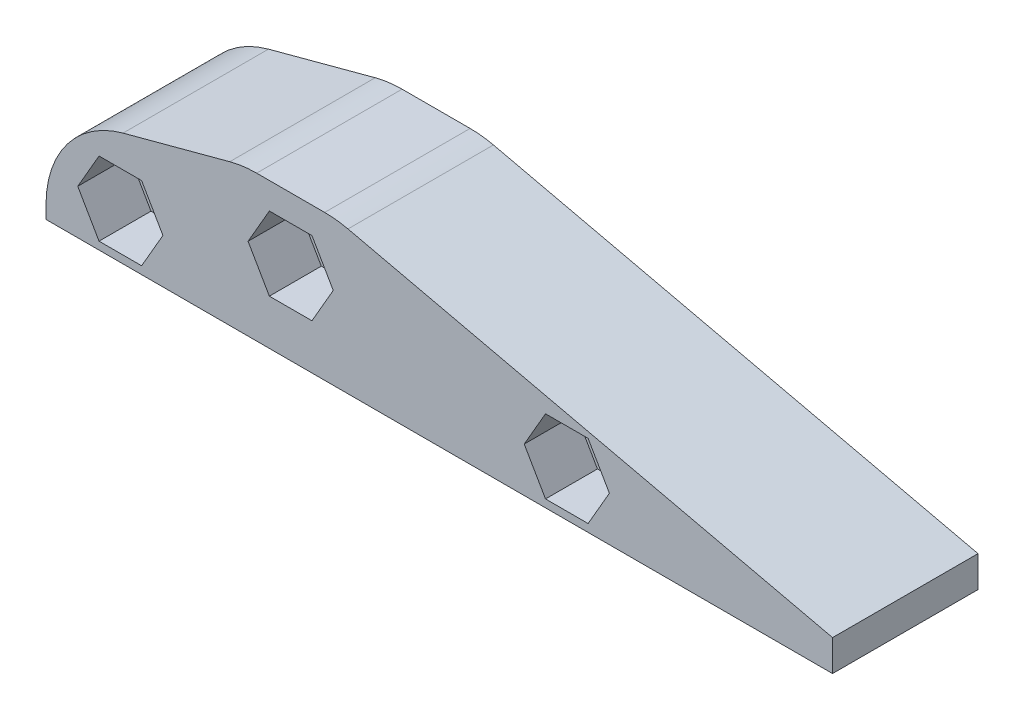
ISO-10303-21;
HEADER;
FILE_DESCRIPTION(('STEP AP214'),'2;1');
FILE_NAME('part.step','',(''),(''),'','','');
FILE_SCHEMA(('AUTOMOTIVE_DESIGN { 1 0 10303 214 1 1 1 1 }'));
ENDSEC;
DATA;
#1=APPLICATION_CONTEXT('core data for automotive mechanical design processes');
#2=APPLICATION_PROTOCOL_DEFINITION('international standard','automotive_design',2000,#1);
#3=PRODUCT_CONTEXT('',#1,'mechanical');
#4=PRODUCT('Part','Part','',(#3));
#5=PRODUCT_RELATED_PRODUCT_CATEGORY('part','',(#4));
#6=PRODUCT_DEFINITION_FORMATION('','',#4);
#7=PRODUCT_DEFINITION_CONTEXT('part definition',#1,'design');
#8=PRODUCT_DEFINITION('design','',#6,#7);
#9=PRODUCT_DEFINITION_SHAPE('','',#8);
#10=(LENGTH_UNIT() NAMED_UNIT(*) SI_UNIT(.MILLI.,.METRE.));
#11=(NAMED_UNIT(*) PLANE_ANGLE_UNIT() SI_UNIT($,.RADIAN.));
#12=(NAMED_UNIT(*) SI_UNIT($,.STERADIAN.) SOLID_ANGLE_UNIT());
#13=UNCERTAINTY_MEASURE_WITH_UNIT(LENGTH_MEASURE(1.E-05),#10,'distance_accuracy_value','');
#14=(GEOMETRIC_REPRESENTATION_CONTEXT(3) GLOBAL_UNCERTAINTY_ASSIGNED_CONTEXT((#13)) GLOBAL_UNIT_ASSIGNED_CONTEXT((#10,
#11,#12)) REPRESENTATION_CONTEXT('',''));
#15=CARTESIAN_POINT('',(0.,0.,0.));
#16=DIRECTION('',(0.,0.,1.));
#17=DIRECTION('',(1.,0.,0.));
#18=AXIS2_PLACEMENT_3D('',#15,#16,#17);
#19=CARTESIAN_POINT('',(75.7081636477034,0.,14.));
#20=DIRECTION('',(0.,1.,0.));
#21=DIRECTION('',(-1.,0.,0.));
#22=AXIS2_PLACEMENT_3D('',#19,#20,#21);
#23=PLANE('',#22);
#24=DIRECTION('',(1.,0.,0.));
#25=VECTOR('',#24,1.);
#26=CARTESIAN_POINT('',(75.7081636477034,0.,0.));
#27=LINE('',#26,#25);
#28=CARTESIAN_POINT('',(0.,0.,0.));
#29=VERTEX_POINT('',#28);
#30=CARTESIAN_POINT('',(75.7081636477034,0.,0.));
#31=VERTEX_POINT('',#30);
#32=EDGE_CURVE('E355',#29,#31,#27,.T.);
#33=ORIENTED_EDGE('',*,*,#32,.T.);
#34=DIRECTION('',(0.,0.,-1.));
#35=VECTOR('',#34,1.);
#36=CARTESIAN_POINT('',(75.7081636477034,0.,14.));
#37=LINE('',#36,#35);
#38=CARTESIAN_POINT('',(75.7081636477034,0.,14.));
#39=VERTEX_POINT('',#38);
#40=EDGE_CURVE('E401',#39,#31,#37,.T.);
#41=ORIENTED_EDGE('',*,*,#40,.F.);
#42=DIRECTION('',(1.,0.,0.));
#43=VECTOR('',#42,1.);
#44=CARTESIAN_POINT('',(75.7081636477034,0.,14.));
#45=LINE('',#44,#43);
#46=CARTESIAN_POINT('',(0.,0.,14.));
#47=VERTEX_POINT('',#46);
#48=EDGE_CURVE('E366',#47,#39,#45,.T.);
#49=ORIENTED_EDGE('',*,*,#48,.F.);
#50=DIRECTION('',(0.,0.,-1.));
#51=VECTOR('',#50,1.);
#52=CARTESIAN_POINT('',(0.,0.,14.));
#53=LINE('',#52,#51);
#54=EDGE_CURVE('E382',#47,#29,#53,.T.);
#55=ORIENTED_EDGE('',*,*,#54,.T.);
#56=EDGE_LOOP('',(#33,#41,#49,#55));
#57=FACE_BOUND('',#56,.T.);
#58=ADVANCED_FACE('F34',(#57),#23,.F.);
#59=CARTESIAN_POINT('',(75.7081636477034,3.,14.));
#60=DIRECTION('',(-1.,0.,0.));
#61=DIRECTION('',(0.,0.,1.));
#62=AXIS2_PLACEMENT_3D('',#59,#60,#61);
#63=PLANE('',#62);
#64=DIRECTION('',(0.,1.,0.));
#65=VECTOR('',#64,1.);
#66=CARTESIAN_POINT('',(75.7081636477034,3.,0.));
#67=LINE('',#66,#65);
#68=CARTESIAN_POINT('',(75.7081636477034,3.,0.));
#69=VERTEX_POINT('',#68);
#70=EDGE_CURVE('E385',#31,#69,#67,.T.);
#71=ORIENTED_EDGE('',*,*,#70,.T.);
#72=DIRECTION('',(0.,0.,-1.));
#73=VECTOR('',#72,1.);
#74=CARTESIAN_POINT('',(75.7081636477034,3.,14.));
#75=LINE('',#74,#73);
#76=CARTESIAN_POINT('',(75.7081636477034,3.,14.));
#77=VERTEX_POINT('',#76);
#78=EDGE_CURVE('E398',#77,#69,#75,.T.);
#79=ORIENTED_EDGE('',*,*,#78,.F.);
#80=DIRECTION('',(0.,1.,0.));
#81=VECTOR('',#80,1.);
#82=CARTESIAN_POINT('',(75.7081636477034,3.,14.));
#83=LINE('',#82,#81);
#84=EDGE_CURVE('E369',#39,#77,#83,.T.);
#85=ORIENTED_EDGE('',*,*,#84,.F.);
#86=ORIENTED_EDGE('',*,*,#40,.T.);
#87=EDGE_LOOP('',(#71,#79,#85,#86));
#88=FACE_BOUND('',#87,.T.);
#89=ADVANCED_FACE('F448',(#88),#63,.F.);
#90=CARTESIAN_POINT('',(27.9588181024501,14.,14.));
#91=DIRECTION('',(-0.224489795918367,-0.974476439699047,0.));
#92=DIRECTION('',(0.974476439699047,-0.224489795918367,0.));
#93=AXIS2_PLACEMENT_3D('',#90,#91,#92);
#94=PLANE('',#93);
#95=DIRECTION('',(-0.974476439699047,0.224489795918367,0.));
#96=VECTOR('',#95,1.);
#97=CARTESIAN_POINT('',(27.9588181024501,14.,0.));
#98=LINE('',#97,#96);
#99=CARTESIAN_POINT('',(29.0667574664095,13.7447643969905,0.));
#100=VERTEX_POINT('',#99);
#101=EDGE_CURVE('E387',#69,#100,#98,.T.);
#102=ORIENTED_EDGE('',*,*,#101,.T.);
#103=DIRECTION('',(0.,0.,-1.));
#104=VECTOR('',#103,1.);
#105=CARTESIAN_POINT('',(29.0667574664095,13.7447643969905,14.));
#106=LINE('',#105,#104);
#107=CARTESIAN_POINT('',(29.0667574664095,13.7447643969905,14.));
#108=VERTEX_POINT('',#107);
#109=EDGE_CURVE('E424',#100,#108,#106,.F.);
#110=ORIENTED_EDGE('',*,*,#109,.T.);
#111=DIRECTION('',(-0.974476439699047,0.224489795918367,0.));
#112=VECTOR('',#111,1.);
#113=CARTESIAN_POINT('',(27.9588181024501,14.,14.));
#114=LINE('',#113,#112);
#115=EDGE_CURVE('E372',#77,#108,#114,.T.);
#116=ORIENTED_EDGE('',*,*,#115,.F.);
#117=ORIENTED_EDGE('',*,*,#78,.T.);
#118=EDGE_LOOP('',(#102,#110,#116,#117));
#119=FACE_BOUND('',#118,.T.);
#120=ADVANCED_FACE('F445',(#119),#94,.F.);
#121=CARTESIAN_POINT('',(18.9588181024501,14.,14.));
#122=DIRECTION('',(0.,-1.,0.));
#123=DIRECTION('',(0.,0.,-1.));
#124=AXIS2_PLACEMENT_3D('',#121,#122,#123);
#125=PLANE('',#124);
#126=DIRECTION('',(-1.,0.,0.));
#127=VECTOR('',#126,1.);
#128=CARTESIAN_POINT('',(18.9588181024501,14.,14.));
#129=LINE('',#128,#127);
#130=CARTESIAN_POINT('',(26.8218595072258,14.,14.));
#131=VERTEX_POINT('',#130);
#132=CARTESIAN_POINT('',(20.275343078324,14.,14.));
#133=VERTEX_POINT('',#132);
#134=EDGE_CURVE('E375',#131,#133,#129,.T.);
#135=ORIENTED_EDGE('',*,*,#134,.F.);
#136=DIRECTION('',(0.,0.,-1.));
#137=VECTOR('',#136,1.);
#138=CARTESIAN_POINT('',(26.8218595072258,14.,14.));
#139=LINE('',#138,#137);
#140=CARTESIAN_POINT('',(26.8218595072258,14.,0.));
#141=VERTEX_POINT('',#140);
#142=EDGE_CURVE('E417',#131,#141,#139,.T.);
#143=ORIENTED_EDGE('',*,*,#142,.T.);
#144=DIRECTION('',(-1.,0.,0.));
#145=VECTOR('',#144,1.);
#146=CARTESIAN_POINT('',(18.9588181024501,14.,0.));
#147=LINE('',#146,#145);
#148=CARTESIAN_POINT('',(20.275343078324,14.,0.));
#149=VERTEX_POINT('',#148);
#150=EDGE_CURVE('E390',#141,#149,#147,.T.);
#151=ORIENTED_EDGE('',*,*,#150,.T.);
#152=DIRECTION('',(0.,0.,-1.));
#153=VECTOR('',#152,1.);
#154=CARTESIAN_POINT('',(20.275343078324,14.,14.));
#155=LINE('',#154,#153);
#156=EDGE_CURVE('E415',#149,#133,#155,.F.);
#157=ORIENTED_EDGE('',*,*,#156,.T.);
#158=EDGE_LOOP('',(#135,#143,#151,#157));
#159=FACE_BOUND('',#158,.T.);
#160=ADVANCED_FACE('F437',(#159),#125,.F.);
#161=CARTESIAN_POINT('',(0.,8.92,14.));
#162=DIRECTION('',(0.258819045102518,-0.965925826289069,0.));
#163=DIRECTION('',(0.965925826289069,0.258819045102518,0.));
#164=AXIS2_PLACEMENT_3D('',#161,#162,#163);
#165=PLANE('',#164);
#166=DIRECTION('',(-0.965925826289069,-0.258819045102518,0.));
#167=VECTOR('',#166,1.);
#168=CARTESIAN_POINT('',(0.,8.92,14.));
#169=LINE('',#168,#167);
#170=CARTESIAN_POINT('',(17.6871526272989,13.6592582628907,14.));
#171=VERTEX_POINT('',#170);
#172=CARTESIAN_POINT('',(7.41180954897482,10.9059883831011,14.));
#173=VERTEX_POINT('',#172);
#174=EDGE_CURVE('E378',#171,#173,#169,.T.);
#175=ORIENTED_EDGE('',*,*,#174,.F.);
#176=DIRECTION('',(0.,0.,-1.));
#177=VECTOR('',#176,1.);
#178=CARTESIAN_POINT('',(17.6871526272989,13.6592582628907,14.));
#179=LINE('',#178,#177);
#180=CARTESIAN_POINT('',(17.6871526272989,13.6592582628907,0.));
#181=VERTEX_POINT('',#180);
#182=EDGE_CURVE('E11',#171,#181,#179,.T.);
#183=ORIENTED_EDGE('',*,*,#182,.T.);
#184=DIRECTION('',(-0.965925826289069,-0.258819045102518,0.));
#185=VECTOR('',#184,1.);
#186=CARTESIAN_POINT('',(0.,8.92,0.));
#187=LINE('',#186,#185);
#188=CARTESIAN_POINT('',(7.41180954897482,10.9059883831011,0.));
#189=VERTEX_POINT('',#188);
#190=EDGE_CURVE('E393',#181,#189,#187,.T.);
#191=ORIENTED_EDGE('',*,*,#190,.T.);
#192=DIRECTION('',(0.,0.,-1.));
#193=VECTOR('',#192,1.);
#194=CARTESIAN_POINT('',(7.41180954897482,10.9059883831011,14.));
#195=LINE('',#194,#193);
#196=EDGE_CURVE('E410',#189,#173,#195,.F.);
#197=ORIENTED_EDGE('',*,*,#196,.T.);
#198=EDGE_LOOP('',(#175,#183,#191,#197));
#199=FACE_BOUND('',#198,.T.);
#200=ADVANCED_FACE('F466',(#199),#165,.F.);
#201=CARTESIAN_POINT('',(0.,0.,14.));
#202=DIRECTION('',(1.,0.,0.));
#203=DIRECTION('',(0.,0.,-1.));
#204=AXIS2_PLACEMENT_3D('',#201,#202,#203);
#205=PLANE('',#204);
#206=DIRECTION('',(0.,-1.,0.));
#207=VECTOR('',#206,1.);
#208=CARTESIAN_POINT('',(0.,0.,14.));
#209=LINE('',#208,#207);
#210=CARTESIAN_POINT('',(0.,1.24673012021037,14.));
#211=VERTEX_POINT('',#210);
#212=EDGE_CURVE('E380',#211,#47,#209,.T.);
#213=ORIENTED_EDGE('',*,*,#212,.F.);
#214=DIRECTION('',(0.,0.,-1.));
#215=VECTOR('',#214,1.);
#216=CARTESIAN_POINT('',(0.,1.24673012021037,14.));
#217=LINE('',#216,#215);
#218=CARTESIAN_POINT('',(0.,1.24673012021037,0.));
#219=VERTEX_POINT('',#218);
#220=EDGE_CURVE('E404',#211,#219,#217,.T.);
#221=ORIENTED_EDGE('',*,*,#220,.T.);
#222=DIRECTION('',(0.,-1.,0.));
#223=VECTOR('',#222,1.);
#224=CARTESIAN_POINT('',(0.,0.,0.));
#225=LINE('',#224,#223);
#226=EDGE_CURVE('E370',#219,#29,#225,.T.);
#227=ORIENTED_EDGE('',*,*,#226,.T.);
#228=ORIENTED_EDGE('',*,*,#54,.F.);
#229=EDGE_LOOP('',(#213,#221,#227,#228));
#230=FACE_BOUND('',#229,.T.);
#231=ADVANCED_FACE('F457',(#230),#205,.F.);
#232=CARTESIAN_POINT('',(0.,0.,14.));
#233=DIRECTION('',(0.,0.,-1.));
#234=DIRECTION('',(-1.,0.,0.));
#235=AXIS2_PLACEMENT_3D('',#232,#233,#234);
#236=PLANE('',#235);
#237=DIRECTION('',(0.5,0.866025403784438,0.));
#238=VECTOR('',#237,1.);
#239=CARTESIAN_POINT('',(25.5981947483981,4.35688835550412,14.));
#240=LINE('',#239,#238);
#241=CARTESIAN_POINT('',(25.5981947483981,4.35688835550412,14.));
#242=VERTEX_POINT('',#241);
#243=CARTESIAN_POINT('',(27.6477882040213,7.90688835550412,14.));
#244=VERTEX_POINT('',#243);
#245=EDGE_CURVE('E251',#242,#244,#240,.T.);
#246=ORIENTED_EDGE('',*,*,#245,.F.);
#247=DIRECTION('',(1.,0.,0.));
#248=VECTOR('',#247,1.);
#249=CARTESIAN_POINT('',(21.4990078371518,4.35688835550412,14.));
#250=LINE('',#249,#248);
#251=CARTESIAN_POINT('',(21.4990078371518,4.35688835550412,14.));
#252=VERTEX_POINT('',#251);
#253=EDGE_CURVE('E49',#252,#242,#250,.T.);
#254=ORIENTED_EDGE('',*,*,#253,.F.);
#255=DIRECTION('',(0.499999999999999,-0.866025403784439,0.));
#256=VECTOR('',#255,1.);
#257=CARTESIAN_POINT('',(19.4494143815286,7.90688835550412,14.));
#258=LINE('',#257,#256);
#259=CARTESIAN_POINT('',(19.4494143815286,7.90688835550412,14.));
#260=VERTEX_POINT('',#259);
#261=EDGE_CURVE('E234',#260,#252,#258,.T.);
#262=ORIENTED_EDGE('',*,*,#261,.F.);
#263=DIRECTION('',(-0.5,-0.866025403784439,0.));
#264=VECTOR('',#263,1.);
#265=CARTESIAN_POINT('',(21.4990078371518,11.4568883555041,14.));
#266=LINE('',#265,#264);
#267=CARTESIAN_POINT('',(21.4990078371518,11.4568883555041,14.));
#268=VERTEX_POINT('',#267);
#269=EDGE_CURVE('E237',#268,#260,#266,.T.);
#270=ORIENTED_EDGE('',*,*,#269,.F.);
#271=DIRECTION('',(-1.,0.,0.));
#272=VECTOR('',#271,1.);
#273=CARTESIAN_POINT('',(25.5981947483981,11.4568883555041,14.));
#274=LINE('',#273,#272);
#275=CARTESIAN_POINT('',(25.5981947483981,11.4568883555041,14.));
#276=VERTEX_POINT('',#275);
#277=EDGE_CURVE('E257',#276,#268,#274,.T.);
#278=ORIENTED_EDGE('',*,*,#277,.F.);
#279=DIRECTION('',(-0.5,0.866025403784438,0.));
#280=VECTOR('',#279,1.);
#281=CARTESIAN_POINT('',(27.6477882040213,7.90688835550412,14.));
#282=LINE('',#281,#280);
#283=EDGE_CURVE('E254',#244,#276,#282,.T.);
#284=ORIENTED_EDGE('',*,*,#283,.F.);
#285=EDGE_LOOP('',(#246,#254,#262,#270,#278,#284));
#286=FACE_BOUND('',#285,.T.);
#287=DIRECTION('',(0.5,0.866025403784438,0.));
#288=VECTOR('',#287,1.);
#289=CARTESIAN_POINT('',(52.1792396702856,0.743591352414853,14.));
#290=LINE('',#289,#288);
#291=CARTESIAN_POINT('',(52.1792396702856,0.743591352414853,14.));
#292=VERTEX_POINT('',#291);
#293=CARTESIAN_POINT('',(54.2288331259088,4.29359135241486,14.));
#294=VERTEX_POINT('',#293);
#295=EDGE_CURVE('E293',#292,#294,#290,.T.);
#296=ORIENTED_EDGE('',*,*,#295,.F.);
#297=DIRECTION('',(1.,0.,0.));
#298=VECTOR('',#297,1.);
#299=CARTESIAN_POINT('',(48.0800527590393,0.743591352414853,14.));
#300=LINE('',#299,#298);
#301=CARTESIAN_POINT('',(48.0800527590393,0.743591352414853,14.));
#302=VERTEX_POINT('',#301);
#303=EDGE_CURVE('E57',#302,#292,#300,.T.);
#304=ORIENTED_EDGE('',*,*,#303,.F.);
#305=DIRECTION('',(0.5,-0.866025403784438,0.));
#306=VECTOR('',#305,1.);
#307=CARTESIAN_POINT('',(46.0304593034161,4.29359135241486,14.));
#308=LINE('',#307,#306);
#309=CARTESIAN_POINT('',(46.0304593034161,4.29359135241486,14.));
#310=VERTEX_POINT('',#309);
#311=EDGE_CURVE('E276',#310,#302,#308,.T.);
#312=ORIENTED_EDGE('',*,*,#311,.F.);
#313=DIRECTION('',(-0.5,-0.866025403784438,0.));
#314=VECTOR('',#313,1.);
#315=CARTESIAN_POINT('',(48.0800527590392,7.84359135241487,14.));
#316=LINE('',#315,#314);
#317=CARTESIAN_POINT('',(48.0800527590392,7.84359135241487,14.));
#318=VERTEX_POINT('',#317);
#319=EDGE_CURVE('E303',#318,#310,#316,.T.);
#320=ORIENTED_EDGE('',*,*,#319,.F.);
#321=DIRECTION('',(-1.,0.,0.));
#322=VECTOR('',#321,1.);
#323=CARTESIAN_POINT('',(52.1792396702856,7.84359135241487,14.));
#324=LINE('',#323,#322);
#325=CARTESIAN_POINT('',(52.1792396702856,7.84359135241487,14.));
#326=VERTEX_POINT('',#325);
#327=EDGE_CURVE('E300',#326,#318,#324,.T.);
#328=ORIENTED_EDGE('',*,*,#327,.F.);
#329=DIRECTION('',(-0.499999999999999,0.866025403784439,0.));
#330=VECTOR('',#329,1.);
#331=CARTESIAN_POINT('',(54.2288331259088,4.29359135241486,14.));
#332=LINE('',#331,#330);
#333=EDGE_CURVE('E297',#294,#326,#332,.T.);
#334=ORIENTED_EDGE('',*,*,#333,.F.);
#335=EDGE_LOOP('',(#296,#304,#312,#320,#328,#334));
#336=FACE_BOUND('',#335,.T.);
#337=DIRECTION('',(0.5,0.866025403784439,0.));
#338=VECTOR('',#337,1.);
#339=CARTESIAN_POINT('',(9.2045979231864,0.743591352414859,14.));
#340=LINE('',#339,#338);
#341=CARTESIAN_POINT('',(9.2045979231864,0.743591352414859,14.));
#342=VERTEX_POINT('',#341);
#343=CARTESIAN_POINT('',(11.2541913788096,4.29359135241486,14.));
#344=VERTEX_POINT('',#343);
#345=EDGE_CURVE('E339',#342,#344,#340,.T.);
#346=ORIENTED_EDGE('',*,*,#345,.F.);
#347=DIRECTION('',(1.,0.,0.));
#348=VECTOR('',#347,1.);
#349=CARTESIAN_POINT('',(5.10541101194006,0.743591352414859,14.));
#350=LINE('',#349,#348);
#351=CARTESIAN_POINT('',(5.10541101194006,0.743591352414859,14.));
#352=VERTEX_POINT('',#351);
#353=EDGE_CURVE('E264',#352,#342,#350,.T.);
#354=ORIENTED_EDGE('',*,*,#353,.F.);
#355=DIRECTION('',(0.5,-0.866025403784439,0.));
#356=VECTOR('',#355,1.);
#357=CARTESIAN_POINT('',(3.05581755631689,4.29359135241486,14.));
#358=LINE('',#357,#356);
#359=CARTESIAN_POINT('',(3.05581755631689,4.29359135241486,14.));
#360=VERTEX_POINT('',#359);
#361=EDGE_CURVE('E322',#360,#352,#358,.T.);
#362=ORIENTED_EDGE('',*,*,#361,.F.);
#363=DIRECTION('',(-0.5,-0.866025403784439,0.));
#364=VECTOR('',#363,1.);
#365=CARTESIAN_POINT('',(5.10541101194006,7.84359135241486,14.));
#366=LINE('',#365,#364);
#367=CARTESIAN_POINT('',(5.10541101194006,7.84359135241486,14.));
#368=VERTEX_POINT('',#367);
#369=EDGE_CURVE('E348',#368,#360,#366,.T.);
#370=ORIENTED_EDGE('',*,*,#369,.F.);
#371=DIRECTION('',(-1.,0.,0.));
#372=VECTOR('',#371,1.);
#373=CARTESIAN_POINT('',(9.2045979231864,7.84359135241486,14.));
#374=LINE('',#373,#372);
#375=CARTESIAN_POINT('',(9.2045979231864,7.84359135241486,14.));
#376=VERTEX_POINT('',#375);
#377=EDGE_CURVE('E345',#376,#368,#374,.T.);
#378=ORIENTED_EDGE('',*,*,#377,.F.);
#379=DIRECTION('',(-0.5,0.866025403784439,0.));
#380=VECTOR('',#379,1.);
#381=CARTESIAN_POINT('',(11.2541913788096,4.29359135241486,14.));
#382=LINE('',#381,#380);
#383=EDGE_CURVE('E342',#344,#376,#382,.T.);
#384=ORIENTED_EDGE('',*,*,#383,.F.);
#385=EDGE_LOOP('',(#346,#354,#362,#370,#378,#384));
#386=FACE_BOUND('',#385,.T.);
#387=ORIENTED_EDGE('',*,*,#115,.T.);
#388=CARTESIAN_POINT('',(26.8218595072258,3.99999999999999,14.));
#389=DIRECTION('',(0.,0.,-1.));
#390=DIRECTION('',(-1.,0.,0.));
#391=AXIS2_PLACEMENT_3D('',#388,#389,#390);
#392=CIRCLE('',#391,10.);
#393=EDGE_CURVE('E42',#108,#131,#392,.F.);
#394=ORIENTED_EDGE('',*,*,#393,.T.);
#395=ORIENTED_EDGE('',*,*,#134,.T.);
#396=CARTESIAN_POINT('',(20.275343078324,3.99999999999999,14.));
#397=DIRECTION('',(0.,0.,-1.));
#398=DIRECTION('',(-1.,0.,0.));
#399=AXIS2_PLACEMENT_3D('',#396,#397,#398);
#400=CIRCLE('',#399,10.);
#401=EDGE_CURVE('E426',#133,#171,#400,.F.);
#402=ORIENTED_EDGE('',*,*,#401,.T.);
#403=ORIENTED_EDGE('',*,*,#174,.T.);
#404=CARTESIAN_POINT('',(10.,1.24673012021037,14.));
#405=DIRECTION('',(0.,0.,-1.));
#406=DIRECTION('',(-1.,0.,0.));
#407=AXIS2_PLACEMENT_3D('',#404,#405,#406);
#408=CIRCLE('',#407,10.);
#409=EDGE_CURVE('E413',#173,#211,#408,.F.);
#410=ORIENTED_EDGE('',*,*,#409,.T.);
#411=ORIENTED_EDGE('',*,*,#212,.T.);
#412=ORIENTED_EDGE('',*,*,#48,.T.);
#413=ORIENTED_EDGE('',*,*,#84,.T.);
#414=EDGE_LOOP('',(#387,#394,#395,#402,#403,#410,#411,#412,#413));
#415=FACE_BOUND('',#414,.T.);
#416=ADVANCED_FACE('F430',(#286,#336,#386,#415),#236,.F.);
#417=CARTESIAN_POINT('',(0.,0.,0.));
#418=DIRECTION('',(0.,0.,-1.));
#419=DIRECTION('',(-1.,0.,0.));
#420=AXIS2_PLACEMENT_3D('',#417,#418,#419);
#421=PLANE('',#420);
#422=CARTESIAN_POINT('',(23.5486012927749,7.90688835550412,0.));
#423=DIRECTION('',(0.,0.,1.));
#424=DIRECTION('',(1.,0.,0.));
#425=AXIS2_PLACEMENT_3D('',#422,#423,#424);
#426=CIRCLE('',#425,2.05);
#427=CARTESIAN_POINT('',(25.5986012927749,7.90688835550412,0.));
#428=VERTEX_POINT('',#427);
#429=EDGE_CURVE('E782',#428,#428,#426,.T.);
#430=ORIENTED_EDGE('',*,*,#429,.T.);
#431=EDGE_LOOP('',(#430));
#432=FACE_BOUND('',#431,.T.);
#433=CARTESIAN_POINT('',(50.1296462146624,4.29359135241486,0.));
#434=DIRECTION('',(0.,0.,1.));
#435=DIRECTION('',(1.,0.,0.));
#436=AXIS2_PLACEMENT_3D('',#433,#434,#435);
#437=CIRCLE('',#436,2.04999999999999);
#438=CARTESIAN_POINT('',(52.1796462146624,4.29359135241486,0.));
#439=VERTEX_POINT('',#438);
#440=EDGE_CURVE('E770',#439,#439,#437,.T.);
#441=ORIENTED_EDGE('',*,*,#440,.T.);
#442=EDGE_LOOP('',(#441));
#443=FACE_BOUND('',#442,.T.);
#444=CARTESIAN_POINT('',(7.15500446756323,4.29359135241486,0.));
#445=DIRECTION('',(0.,0.,1.));
#446=DIRECTION('',(1.,0.,0.));
#447=AXIS2_PLACEMENT_3D('',#444,#445,#446);
#448=CIRCLE('',#447,2.05);
#449=CARTESIAN_POINT('',(9.20500446756323,4.29359135241486,0.));
#450=VERTEX_POINT('',#449);
#451=EDGE_CURVE('E294',#450,#450,#448,.T.);
#452=ORIENTED_EDGE('',*,*,#451,.T.);
#453=EDGE_LOOP('',(#452));
#454=FACE_BOUND('',#453,.T.);
#455=ORIENTED_EDGE('',*,*,#150,.F.);
#456=CARTESIAN_POINT('',(26.8218595072258,3.99999999999999,0.));
#457=DIRECTION('',(0.,0.,-1.));
#458=DIRECTION('',(-1.,0.,0.));
#459=AXIS2_PLACEMENT_3D('',#456,#457,#458);
#460=CIRCLE('',#459,10.);
#461=EDGE_CURVE('E422',#141,#100,#460,.T.);
#462=ORIENTED_EDGE('',*,*,#461,.T.);
#463=ORIENTED_EDGE('',*,*,#101,.F.);
#464=ORIENTED_EDGE('',*,*,#70,.F.);
#465=ORIENTED_EDGE('',*,*,#32,.F.);
#466=ORIENTED_EDGE('',*,*,#226,.F.);
#467=CARTESIAN_POINT('',(10.,1.24673012021037,0.));
#468=DIRECTION('',(0.,0.,-1.));
#469=DIRECTION('',(-1.,0.,0.));
#470=AXIS2_PLACEMENT_3D('',#467,#468,#469);
#471=CIRCLE('',#470,10.);
#472=EDGE_CURVE('E407',#219,#189,#471,.T.);
#473=ORIENTED_EDGE('',*,*,#472,.T.);
#474=ORIENTED_EDGE('',*,*,#190,.F.);
#475=CARTESIAN_POINT('',(20.275343078324,3.99999999999999,0.));
#476=DIRECTION('',(0.,0.,-1.));
#477=DIRECTION('',(-1.,0.,0.));
#478=AXIS2_PLACEMENT_3D('',#475,#476,#477);
#479=CIRCLE('',#478,10.);
#480=EDGE_CURVE('E420',#181,#149,#479,.T.);
#481=ORIENTED_EDGE('',*,*,#480,.T.);
#482=EDGE_LOOP('',(#455,#462,#463,#464,#465,#466,#473,#474,#481));
#483=FACE_BOUND('',#482,.T.);
#484=ADVANCED_FACE('F443',(#432,#443,#454,#483),#421,.T.);
#485=CARTESIAN_POINT('',(10.,1.24673012021037,14.));
#486=DIRECTION('',(0.,0.,-1.));
#487=DIRECTION('',(-1.,0.,0.));
#488=AXIS2_PLACEMENT_3D('',#485,#486,#487);
#489=CYLINDRICAL_SURFACE('',#488,10.);
#490=ORIENTED_EDGE('',*,*,#409,.F.);
#491=ORIENTED_EDGE('',*,*,#196,.F.);
#492=ORIENTED_EDGE('',*,*,#472,.F.);
#493=ORIENTED_EDGE('',*,*,#220,.F.);
#494=EDGE_LOOP('',(#490,#491,#492,#493));
#495=FACE_BOUND('',#494,.T.);
#496=ADVANCED_FACE('F461',(#495),#489,.T.);
#497=CARTESIAN_POINT('',(26.8218595072258,3.99999999999999,14.));
#498=DIRECTION('',(0.,0.,-1.));
#499=DIRECTION('',(-1.,0.,0.));
#500=AXIS2_PLACEMENT_3D('',#497,#498,#499);
#501=CYLINDRICAL_SURFACE('',#500,10.);
#502=ORIENTED_EDGE('',*,*,#393,.F.);
#503=ORIENTED_EDGE('',*,*,#109,.F.);
#504=ORIENTED_EDGE('',*,*,#461,.F.);
#505=ORIENTED_EDGE('',*,*,#142,.F.);
#506=EDGE_LOOP('',(#502,#503,#504,#505));
#507=FACE_BOUND('',#506,.T.);
#508=ADVANCED_FACE('F440',(#507),#501,.T.);
#509=CARTESIAN_POINT('',(20.275343078324,3.99999999999999,14.));
#510=DIRECTION('',(0.,0.,-1.));
#511=DIRECTION('',(-1.,0.,0.));
#512=AXIS2_PLACEMENT_3D('',#509,#510,#511);
#513=CYLINDRICAL_SURFACE('',#512,10.);
#514=ORIENTED_EDGE('',*,*,#401,.F.);
#515=ORIENTED_EDGE('',*,*,#156,.F.);
#516=ORIENTED_EDGE('',*,*,#480,.F.);
#517=ORIENTED_EDGE('',*,*,#182,.F.);
#518=EDGE_LOOP('',(#514,#515,#516,#517));
#519=FACE_BOUND('',#518,.T.);
#520=ADVANCED_FACE('F36',(#519),#513,.T.);
#521=CARTESIAN_POINT('',(5.10541101194006,0.743591352414859,9.));
#522=DIRECTION('',(0.,-1.,0.));
#523=DIRECTION('',(0.,0.,-1.));
#524=AXIS2_PLACEMENT_3D('',#521,#522,#523);
#525=PLANE('',#524);
#526=ORIENTED_EDGE('',*,*,#353,.T.);
#527=DIRECTION('',(0.,0.,1.));
#528=VECTOR('',#527,1.);
#529=CARTESIAN_POINT('',(9.2045979231864,0.743591352414859,9.));
#530=LINE('',#529,#528);
#531=CARTESIAN_POINT('',(9.2045979231864,0.743591352414859,9.));
#532=VERTEX_POINT('',#531);
#533=EDGE_CURVE('E337',#532,#342,#530,.T.);
#534=ORIENTED_EDGE('',*,*,#533,.F.);
#535=DIRECTION('',(1.,0.,0.));
#536=VECTOR('',#535,1.);
#537=CARTESIAN_POINT('',(5.10541101194006,0.743591352414859,9.));
#538=LINE('',#537,#536);
#539=CARTESIAN_POINT('',(5.10541101194006,0.743591352414859,9.));
#540=VERTEX_POINT('',#539);
#541=EDGE_CURVE('E318',#540,#532,#538,.T.);
#542=ORIENTED_EDGE('',*,*,#541,.F.);
#543=DIRECTION('',(0.,0.,1.));
#544=VECTOR('',#543,1.);
#545=CARTESIAN_POINT('',(5.10541101194006,0.743591352414859,9.));
#546=LINE('',#545,#544);
#547=EDGE_CURVE('E353',#540,#352,#546,.T.);
#548=ORIENTED_EDGE('',*,*,#547,.T.);
#549=EDGE_LOOP('',(#526,#534,#542,#548));
#550=FACE_BOUND('',#549,.T.);
#551=ADVANCED_FACE('F470',(#550),#525,.F.);
#552=CARTESIAN_POINT('',(3.05581755631689,4.29359135241486,9.));
#553=DIRECTION('',(-0.866025403784439,-0.5,0.));
#554=DIRECTION('',(0.5,-0.866025403784439,0.));
#555=AXIS2_PLACEMENT_3D('',#552,#553,#554);
#556=PLANE('',#555);
#557=ORIENTED_EDGE('',*,*,#361,.T.);
#558=ORIENTED_EDGE('',*,*,#547,.F.);
#559=DIRECTION('',(0.5,-0.866025403784439,0.));
#560=VECTOR('',#559,1.);
#561=CARTESIAN_POINT('',(3.05581755631689,4.29359135241486,9.));
#562=LINE('',#561,#560);
#563=CARTESIAN_POINT('',(3.05581755631689,4.29359135241486,9.));
#564=VERTEX_POINT('',#563);
#565=EDGE_CURVE('E334',#564,#540,#562,.T.);
#566=ORIENTED_EDGE('',*,*,#565,.F.);
#567=DIRECTION('',(0.,0.,1.));
#568=VECTOR('',#567,1.);
#569=CARTESIAN_POINT('',(3.05581755631689,4.29359135241486,9.));
#570=LINE('',#569,#568);
#571=EDGE_CURVE('E356',#564,#360,#570,.T.);
#572=ORIENTED_EDGE('',*,*,#571,.T.);
#573=EDGE_LOOP('',(#557,#558,#566,#572));
#574=FACE_BOUND('',#573,.T.);
#575=ADVANCED_FACE('F475',(#574),#556,.F.);
#576=CARTESIAN_POINT('',(5.10541101194006,7.84359135241486,9.));
#577=DIRECTION('',(-0.866025403784438,0.5,0.));
#578=DIRECTION('',(-0.5,-0.866025403784438,0.));
#579=AXIS2_PLACEMENT_3D('',#576,#577,#578);
#580=PLANE('',#579);
#581=ORIENTED_EDGE('',*,*,#369,.T.);
#582=ORIENTED_EDGE('',*,*,#571,.F.);
#583=DIRECTION('',(-0.5,-0.866025403784439,0.));
#584=VECTOR('',#583,1.);
#585=CARTESIAN_POINT('',(5.10541101194006,7.84359135241486,9.));
#586=LINE('',#585,#584);
#587=CARTESIAN_POINT('',(5.10541101194006,7.84359135241486,9.));
#588=VERTEX_POINT('',#587);
#589=EDGE_CURVE('E331',#588,#564,#586,.T.);
#590=ORIENTED_EDGE('',*,*,#589,.F.);
#591=DIRECTION('',(0.,0.,1.));
#592=VECTOR('',#591,1.);
#593=CARTESIAN_POINT('',(5.10541101194006,7.84359135241486,9.));
#594=LINE('',#593,#592);
#595=EDGE_CURVE('E358',#588,#368,#594,.T.);
#596=ORIENTED_EDGE('',*,*,#595,.T.);
#597=EDGE_LOOP('',(#581,#582,#590,#596));
#598=FACE_BOUND('',#597,.T.);
#599=ADVANCED_FACE('F545',(#598),#580,.F.);
#600=CARTESIAN_POINT('',(9.2045979231864,7.84359135241486,9.));
#601=DIRECTION('',(0.,1.,0.));
#602=DIRECTION('',(0.,0.,1.));
#603=AXIS2_PLACEMENT_3D('',#600,#601,#602);
#604=PLANE('',#603);
#605=ORIENTED_EDGE('',*,*,#377,.T.);
#606=ORIENTED_EDGE('',*,*,#595,.F.);
#607=DIRECTION('',(-1.,0.,0.));
#608=VECTOR('',#607,1.);
#609=CARTESIAN_POINT('',(9.2045979231864,7.84359135241486,9.));
#610=LINE('',#609,#608);
#611=CARTESIAN_POINT('',(9.2045979231864,7.84359135241486,9.));
#612=VERTEX_POINT('',#611);
#613=EDGE_CURVE('E328',#612,#588,#610,.T.);
#614=ORIENTED_EDGE('',*,*,#613,.F.);
#615=DIRECTION('',(0.,0.,1.));
#616=VECTOR('',#615,1.);
#617=CARTESIAN_POINT('',(9.2045979231864,7.84359135241486,9.));
#618=LINE('',#617,#616);
#619=EDGE_CURVE('E360',#612,#376,#618,.T.);
#620=ORIENTED_EDGE('',*,*,#619,.T.);
#621=EDGE_LOOP('',(#605,#606,#614,#620));
#622=FACE_BOUND('',#621,.T.);
#623=ADVANCED_FACE('F555',(#622),#604,.F.);
#624=CARTESIAN_POINT('',(11.2541913788096,4.29359135241486,9.));
#625=DIRECTION('',(0.866025403784439,0.5,0.));
#626=DIRECTION('',(-0.5,0.866025403784439,0.));
#627=AXIS2_PLACEMENT_3D('',#624,#625,#626);
#628=PLANE('',#627);
#629=ORIENTED_EDGE('',*,*,#383,.T.);
#630=ORIENTED_EDGE('',*,*,#619,.F.);
#631=DIRECTION('',(-0.5,0.866025403784439,0.));
#632=VECTOR('',#631,1.);
#633=CARTESIAN_POINT('',(11.2541913788096,4.29359135241486,9.));
#634=LINE('',#633,#632);
#635=CARTESIAN_POINT('',(11.2541913788096,4.29359135241486,9.));
#636=VERTEX_POINT('',#635);
#637=EDGE_CURVE('E325',#636,#612,#634,.T.);
#638=ORIENTED_EDGE('',*,*,#637,.F.);
#639=DIRECTION('',(0.,0.,1.));
#640=VECTOR('',#639,1.);
#641=CARTESIAN_POINT('',(11.2541913788096,4.29359135241486,9.));
#642=LINE('',#641,#640);
#643=EDGE_CURVE('E362',#636,#344,#642,.T.);
#644=ORIENTED_EDGE('',*,*,#643,.T.);
#645=EDGE_LOOP('',(#629,#630,#638,#644));
#646=FACE_BOUND('',#645,.T.);
#647=ADVANCED_FACE('F565',(#646),#628,.F.);
#648=CARTESIAN_POINT('',(9.2045979231864,0.743591352414859,9.));
#649=DIRECTION('',(0.866025403784439,-0.5,0.));
#650=DIRECTION('',(0.5,0.866025403784439,0.));
#651=AXIS2_PLACEMENT_3D('',#648,#649,#650);
#652=PLANE('',#651);
#653=ORIENTED_EDGE('',*,*,#345,.T.);
#654=ORIENTED_EDGE('',*,*,#643,.F.);
#655=DIRECTION('',(0.5,0.866025403784439,0.));
#656=VECTOR('',#655,1.);
#657=CARTESIAN_POINT('',(9.2045979231864,0.743591352414859,9.));
#658=LINE('',#657,#656);
#659=EDGE_CURVE('E321',#532,#636,#658,.T.);
#660=ORIENTED_EDGE('',*,*,#659,.F.);
#661=ORIENTED_EDGE('',*,*,#533,.T.);
#662=EDGE_LOOP('',(#653,#654,#660,#661));
#663=FACE_BOUND('',#662,.T.);
#664=ADVANCED_FACE('F575',(#663),#652,.F.);
#665=CARTESIAN_POINT('',(0.,0.,9.));
#666=DIRECTION('',(0.,0.,1.));
#667=DIRECTION('',(1.,0.,0.));
#668=AXIS2_PLACEMENT_3D('',#665,#666,#667);
#669=PLANE('',#668);
#670=CARTESIAN_POINT('',(7.15500446756323,4.29359135241486,9.));
#671=DIRECTION('',(0.,0.,1.));
#672=DIRECTION('',(1.,0.,0.));
#673=AXIS2_PLACEMENT_3D('',#670,#671,#672);
#674=CIRCLE('',#673,2.05);
#675=CARTESIAN_POINT('',(9.20500446756323,4.29359135241486,9.));
#676=VERTEX_POINT('',#675);
#677=EDGE_CURVE('E240',#676,#676,#674,.T.);
#678=ORIENTED_EDGE('',*,*,#677,.F.);
#679=EDGE_LOOP('',(#678));
#680=FACE_BOUND('',#679,.T.);
#681=ORIENTED_EDGE('',*,*,#541,.T.);
#682=ORIENTED_EDGE('',*,*,#659,.T.);
#683=ORIENTED_EDGE('',*,*,#637,.T.);
#684=ORIENTED_EDGE('',*,*,#613,.T.);
#685=ORIENTED_EDGE('',*,*,#589,.T.);
#686=ORIENTED_EDGE('',*,*,#565,.T.);
#687=EDGE_LOOP('',(#681,#682,#683,#684,#685,#686));
#688=FACE_BOUND('',#687,.T.);
#689=ADVANCED_FACE('F585',(#680,#688),#669,.T.);
#690=CARTESIAN_POINT('',(48.0800527590393,0.743591352414853,9.));
#691=DIRECTION('',(0.,-1.,0.));
#692=DIRECTION('',(0.,0.,-1.));
#693=AXIS2_PLACEMENT_3D('',#690,#691,#692);
#694=PLANE('',#693);
#695=ORIENTED_EDGE('',*,*,#303,.T.);
#696=DIRECTION('',(0.,0.,1.));
#697=VECTOR('',#696,1.);
#698=CARTESIAN_POINT('',(52.1792396702856,0.743591352414853,9.));
#699=LINE('',#698,#697);
#700=CARTESIAN_POINT('',(52.1792396702856,0.743591352414853,9.));
#701=VERTEX_POINT('',#700);
#702=EDGE_CURVE('E291',#701,#292,#699,.T.);
#703=ORIENTED_EDGE('',*,*,#702,.F.);
#704=DIRECTION('',(1.,0.,0.));
#705=VECTOR('',#704,1.);
#706=CARTESIAN_POINT('',(48.0800527590393,0.743591352414853,9.));
#707=LINE('',#706,#705);
#708=CARTESIAN_POINT('',(48.0800527590393,0.743591352414853,9.));
#709=VERTEX_POINT('',#708);
#710=EDGE_CURVE('E272',#709,#701,#707,.T.);
#711=ORIENTED_EDGE('',*,*,#710,.F.);
#712=DIRECTION('',(0.,0.,1.));
#713=VECTOR('',#712,1.);
#714=CARTESIAN_POINT('',(48.0800527590393,0.743591352414853,9.));
#715=LINE('',#714,#713);
#716=EDGE_CURVE('E252',#709,#302,#715,.T.);
#717=ORIENTED_EDGE('',*,*,#716,.T.);
#718=EDGE_LOOP('',(#695,#703,#711,#717));
#719=FACE_BOUND('',#718,.T.);
#720=ADVANCED_FACE('F593',(#719),#694,.F.);
#721=CARTESIAN_POINT('',(46.0304593034161,4.29359135241486,9.));
#722=DIRECTION('',(-0.866025403784438,-0.5,0.));
#723=DIRECTION('',(0.5,-0.866025403784438,0.));
#724=AXIS2_PLACEMENT_3D('',#721,#722,#723);
#725=PLANE('',#724);
#726=ORIENTED_EDGE('',*,*,#311,.T.);
#727=ORIENTED_EDGE('',*,*,#716,.F.);
#728=DIRECTION('',(0.5,-0.866025403784438,0.));
#729=VECTOR('',#728,1.);
#730=CARTESIAN_POINT('',(46.0304593034161,4.29359135241486,9.));
#731=LINE('',#730,#729);
#732=CARTESIAN_POINT('',(46.0304593034161,4.29359135241486,9.));
#733=VERTEX_POINT('',#732);
#734=EDGE_CURVE('E288',#733,#709,#731,.T.);
#735=ORIENTED_EDGE('',*,*,#734,.F.);
#736=DIRECTION('',(0.,0.,1.));
#737=VECTOR('',#736,1.);
#738=CARTESIAN_POINT('',(46.0304593034161,4.29359135241486,9.));
#739=LINE('',#738,#737);
#740=EDGE_CURVE('E309',#733,#310,#739,.T.);
#741=ORIENTED_EDGE('',*,*,#740,.T.);
#742=EDGE_LOOP('',(#726,#727,#735,#741));
#743=FACE_BOUND('',#742,.T.);
#744=ADVANCED_FACE('F598',(#743),#725,.F.);
#745=CARTESIAN_POINT('',(48.0800527590392,7.84359135241487,9.));
#746=DIRECTION('',(-0.866025403784438,0.5,0.));
#747=DIRECTION('',(-0.5,-0.866025403784439,0.));
#748=AXIS2_PLACEMENT_3D('',#745,#746,#747);
#749=PLANE('',#748);
#750=ORIENTED_EDGE('',*,*,#319,.T.);
#751=ORIENTED_EDGE('',*,*,#740,.F.);
#752=DIRECTION('',(-0.5,-0.866025403784438,0.));
#753=VECTOR('',#752,1.);
#754=CARTESIAN_POINT('',(48.0800527590392,7.84359135241487,9.));
#755=LINE('',#754,#753);
#756=CARTESIAN_POINT('',(48.0800527590392,7.84359135241487,9.));
#757=VERTEX_POINT('',#756);
#758=EDGE_CURVE('E285',#757,#733,#755,.T.);
#759=ORIENTED_EDGE('',*,*,#758,.F.);
#760=DIRECTION('',(0.,0.,1.));
#761=VECTOR('',#760,1.);
#762=CARTESIAN_POINT('',(48.0800527590392,7.84359135241487,9.));
#763=LINE('',#762,#761);
#764=EDGE_CURVE('E311',#757,#318,#763,.T.);
#765=ORIENTED_EDGE('',*,*,#764,.T.);
#766=EDGE_LOOP('',(#750,#751,#759,#765));
#767=FACE_BOUND('',#766,.T.);
#768=ADVANCED_FACE('F607',(#767),#749,.F.);
#769=CARTESIAN_POINT('',(52.1792396702856,7.84359135241487,9.));
#770=DIRECTION('',(0.,1.,0.));
#771=DIRECTION('',(0.,0.,1.));
#772=AXIS2_PLACEMENT_3D('',#769,#770,#771);
#773=PLANE('',#772);
#774=ORIENTED_EDGE('',*,*,#327,.T.);
#775=ORIENTED_EDGE('',*,*,#764,.F.);
#776=DIRECTION('',(-1.,0.,0.));
#777=VECTOR('',#776,1.);
#778=CARTESIAN_POINT('',(52.1792396702856,7.84359135241487,9.));
#779=LINE('',#778,#777);
#780=CARTESIAN_POINT('',(52.1792396702856,7.84359135241487,9.));
#781=VERTEX_POINT('',#780);
#782=EDGE_CURVE('E282',#781,#757,#779,.T.);
#783=ORIENTED_EDGE('',*,*,#782,.F.);
#784=DIRECTION('',(0.,0.,1.));
#785=VECTOR('',#784,1.);
#786=CARTESIAN_POINT('',(52.1792396702856,7.84359135241487,9.));
#787=LINE('',#786,#785);
#788=EDGE_CURVE('E313',#781,#326,#787,.T.);
#789=ORIENTED_EDGE('',*,*,#788,.T.);
#790=EDGE_LOOP('',(#774,#775,#783,#789));
#791=FACE_BOUND('',#790,.T.);
#792=ADVANCED_FACE('F617',(#791),#773,.F.);
#793=CARTESIAN_POINT('',(54.2288331259088,4.29359135241486,9.));
#794=DIRECTION('',(0.866025403784439,0.499999999999999,0.));
#795=DIRECTION('',(-0.499999999999999,0.866025403784439,0.));
#796=AXIS2_PLACEMENT_3D('',#793,#794,#795);
#797=PLANE('',#796);
#798=ORIENTED_EDGE('',*,*,#333,.T.);
#799=ORIENTED_EDGE('',*,*,#788,.F.);
#800=DIRECTION('',(-0.499999999999999,0.866025403784439,0.));
#801=VECTOR('',#800,1.);
#802=CARTESIAN_POINT('',(54.2288331259088,4.29359135241486,9.));
#803=LINE('',#802,#801);
#804=CARTESIAN_POINT('',(54.2288331259088,4.29359135241486,9.));
#805=VERTEX_POINT('',#804);
#806=EDGE_CURVE('E279',#805,#781,#803,.T.);
#807=ORIENTED_EDGE('',*,*,#806,.F.);
#808=DIRECTION('',(0.,0.,1.));
#809=VECTOR('',#808,1.);
#810=CARTESIAN_POINT('',(54.2288331259088,4.29359135241486,9.));
#811=LINE('',#810,#809);
#812=EDGE_CURVE('E315',#805,#294,#811,.T.);
#813=ORIENTED_EDGE('',*,*,#812,.T.);
#814=EDGE_LOOP('',(#798,#799,#807,#813));
#815=FACE_BOUND('',#814,.T.);
#816=ADVANCED_FACE('F627',(#815),#797,.F.);
#817=CARTESIAN_POINT('',(52.1792396702856,0.743591352414853,9.));
#818=DIRECTION('',(0.866025403784439,-0.5,0.));
#819=DIRECTION('',(0.5,0.866025403784439,0.));
#820=AXIS2_PLACEMENT_3D('',#817,#818,#819);
#821=PLANE('',#820);
#822=ORIENTED_EDGE('',*,*,#295,.T.);
#823=ORIENTED_EDGE('',*,*,#812,.F.);
#824=DIRECTION('',(0.5,0.866025403784438,0.));
#825=VECTOR('',#824,1.);
#826=CARTESIAN_POINT('',(52.1792396702856,0.743591352414853,9.));
#827=LINE('',#826,#825);
#828=EDGE_CURVE('E275',#701,#805,#827,.T.);
#829=ORIENTED_EDGE('',*,*,#828,.F.);
#830=ORIENTED_EDGE('',*,*,#702,.T.);
#831=EDGE_LOOP('',(#822,#823,#829,#830));
#832=FACE_BOUND('',#831,.T.);
#833=ADVANCED_FACE('F637',(#832),#821,.F.);
#834=CARTESIAN_POINT('',(0.,0.,9.));
#835=DIRECTION('',(0.,0.,1.));
#836=DIRECTION('',(1.,0.,0.));
#837=AXIS2_PLACEMENT_3D('',#834,#835,#836);
#838=PLANE('',#837);
#839=CARTESIAN_POINT('',(50.1296462146624,4.29359135241486,9.));
#840=DIRECTION('',(0.,0.,1.));
#841=DIRECTION('',(1.,0.,0.));
#842=AXIS2_PLACEMENT_3D('',#839,#840,#841);
#843=CIRCLE('',#842,2.04999999999999);
#844=CARTESIAN_POINT('',(52.1796462146624,4.29359135241486,9.));
#845=VERTEX_POINT('',#844);
#846=EDGE_CURVE('E773',#845,#845,#843,.T.);
#847=ORIENTED_EDGE('',*,*,#846,.F.);
#848=EDGE_LOOP('',(#847));
#849=FACE_BOUND('',#848,.T.);
#850=ORIENTED_EDGE('',*,*,#710,.T.);
#851=ORIENTED_EDGE('',*,*,#828,.T.);
#852=ORIENTED_EDGE('',*,*,#806,.T.);
#853=ORIENTED_EDGE('',*,*,#782,.T.);
#854=ORIENTED_EDGE('',*,*,#758,.T.);
#855=ORIENTED_EDGE('',*,*,#734,.T.);
#856=EDGE_LOOP('',(#850,#851,#852,#853,#854,#855));
#857=FACE_BOUND('',#856,.T.);
#858=ADVANCED_FACE('F647',(#849,#857),#838,.T.);
#859=CARTESIAN_POINT('',(21.4990078371518,4.35688835550412,9.));
#860=DIRECTION('',(0.,-1.,0.));
#861=DIRECTION('',(0.,0.,-1.));
#862=AXIS2_PLACEMENT_3D('',#859,#860,#861);
#863=PLANE('',#862);
#864=ORIENTED_EDGE('',*,*,#253,.T.);
#865=DIRECTION('',(0.,0.,1.));
#866=VECTOR('',#865,1.);
#867=CARTESIAN_POINT('',(25.5981947483981,4.35688835550412,9.));
#868=LINE('',#867,#866);
#869=CARTESIAN_POINT('',(25.5981947483981,4.35688835550412,9.));
#870=VERTEX_POINT('',#869);
#871=EDGE_CURVE('E211',#870,#242,#868,.T.);
#872=ORIENTED_EDGE('',*,*,#871,.F.);
#873=DIRECTION('',(1.,0.,0.));
#874=VECTOR('',#873,1.);
#875=CARTESIAN_POINT('',(21.4990078371518,4.35688835550412,9.));
#876=LINE('',#875,#874);
#877=CARTESIAN_POINT('',(21.4990078371518,4.35688835550412,9.));
#878=VERTEX_POINT('',#877);
#879=EDGE_CURVE('E215',#878,#870,#876,.T.);
#880=ORIENTED_EDGE('',*,*,#879,.F.);
#881=DIRECTION('',(0.,0.,1.));
#882=VECTOR('',#881,1.);
#883=CARTESIAN_POINT('',(21.4990078371518,4.35688835550412,9.));
#884=LINE('',#883,#882);
#885=EDGE_CURVE('E262',#878,#252,#884,.T.);
#886=ORIENTED_EDGE('',*,*,#885,.T.);
#887=EDGE_LOOP('',(#864,#872,#880,#886));
#888=FACE_BOUND('',#887,.T.);
#889=ADVANCED_FACE('F213',(#888),#863,.F.);
#890=CARTESIAN_POINT('',(19.4494143815286,7.90688835550412,9.));
#891=DIRECTION('',(-0.866025403784439,-0.499999999999999,0.));
#892=DIRECTION('',(0.499999999999999,-0.866025403784439,0.));
#893=AXIS2_PLACEMENT_3D('',#890,#891,#892);
#894=PLANE('',#893);
#895=ORIENTED_EDGE('',*,*,#261,.T.);
#896=ORIENTED_EDGE('',*,*,#885,.F.);
#897=DIRECTION('',(0.499999999999999,-0.866025403784439,0.));
#898=VECTOR('',#897,1.);
#899=CARTESIAN_POINT('',(19.4494143815286,7.90688835550412,9.));
#900=LINE('',#899,#898);
#901=CARTESIAN_POINT('',(19.4494143815286,7.90688835550412,9.));
#902=VERTEX_POINT('',#901);
#903=EDGE_CURVE('E221',#902,#878,#900,.T.);
#904=ORIENTED_EDGE('',*,*,#903,.F.);
#905=DIRECTION('',(0.,0.,1.));
#906=VECTOR('',#905,1.);
#907=CARTESIAN_POINT('',(19.4494143815286,7.90688835550412,9.));
#908=LINE('',#907,#906);
#909=EDGE_CURVE('E265',#902,#260,#908,.T.);
#910=ORIENTED_EDGE('',*,*,#909,.T.);
#911=EDGE_LOOP('',(#895,#896,#904,#910));
#912=FACE_BOUND('',#911,.T.);
#913=ADVANCED_FACE('F659',(#912),#894,.F.);
#914=CARTESIAN_POINT('',(21.4990078371518,11.4568883555041,9.));
#915=DIRECTION('',(-0.866025403784439,0.5,0.));
#916=DIRECTION('',(-0.5,-0.866025403784439,0.));
#917=AXIS2_PLACEMENT_3D('',#914,#915,#916);
#918=PLANE('',#917);
#919=ORIENTED_EDGE('',*,*,#269,.T.);
#920=ORIENTED_EDGE('',*,*,#909,.F.);
#921=DIRECTION('',(-0.5,-0.866025403784439,0.));
#922=VECTOR('',#921,1.);
#923=CARTESIAN_POINT('',(21.4990078371518,11.4568883555041,9.));
#924=LINE('',#923,#922);
#925=CARTESIAN_POINT('',(21.4990078371518,11.4568883555041,9.));
#926=VERTEX_POINT('',#925);
#927=EDGE_CURVE('E247',#926,#902,#924,.T.);
#928=ORIENTED_EDGE('',*,*,#927,.F.);
#929=DIRECTION('',(0.,0.,1.));
#930=VECTOR('',#929,1.);
#931=CARTESIAN_POINT('',(21.4990078371518,11.4568883555041,9.));
#932=LINE('',#931,#930);
#933=EDGE_CURVE('E267',#926,#268,#932,.T.);
#934=ORIENTED_EDGE('',*,*,#933,.T.);
#935=EDGE_LOOP('',(#919,#920,#928,#934));
#936=FACE_BOUND('',#935,.T.);
#937=ADVANCED_FACE('F668',(#936),#918,.F.);
#938=CARTESIAN_POINT('',(25.5981947483981,11.4568883555041,9.));
#939=DIRECTION('',(0.,1.,0.));
#940=DIRECTION('',(0.,0.,1.));
#941=AXIS2_PLACEMENT_3D('',#938,#939,#940);
#942=PLANE('',#941);
#943=ORIENTED_EDGE('',*,*,#277,.T.);
#944=ORIENTED_EDGE('',*,*,#933,.F.);
#945=DIRECTION('',(-1.,0.,0.));
#946=VECTOR('',#945,1.);
#947=CARTESIAN_POINT('',(25.5981947483981,11.4568883555041,9.));
#948=LINE('',#947,#946);
#949=CARTESIAN_POINT('',(25.5981947483981,11.4568883555041,9.));
#950=VERTEX_POINT('',#949);
#951=EDGE_CURVE('E244',#950,#926,#948,.T.);
#952=ORIENTED_EDGE('',*,*,#951,.F.);
#953=DIRECTION('',(0.,0.,1.));
#954=VECTOR('',#953,1.);
#955=CARTESIAN_POINT('',(25.5981947483981,11.4568883555041,9.));
#956=LINE('',#955,#954);
#957=EDGE_CURVE('E269',#950,#276,#956,.T.);
#958=ORIENTED_EDGE('',*,*,#957,.T.);
#959=EDGE_LOOP('',(#943,#944,#952,#958));
#960=FACE_BOUND('',#959,.T.);
#961=ADVANCED_FACE('F678',(#960),#942,.F.);
#962=CARTESIAN_POINT('',(27.6477882040213,7.90688835550412,9.));
#963=DIRECTION('',(0.866025403784438,0.5,0.));
#964=DIRECTION('',(-0.5,0.866025403784439,0.));
#965=AXIS2_PLACEMENT_3D('',#962,#963,#964);
#966=PLANE('',#965);
#967=ORIENTED_EDGE('',*,*,#283,.T.);
#968=ORIENTED_EDGE('',*,*,#957,.F.);
#969=DIRECTION('',(-0.5,0.866025403784438,0.));
#970=VECTOR('',#969,1.);
#971=CARTESIAN_POINT('',(27.6477882040213,7.90688835550412,9.));
#972=LINE('',#971,#970);
#973=CARTESIAN_POINT('',(27.6477882040213,7.90688835550412,9.));
#974=VERTEX_POINT('',#973);
#975=EDGE_CURVE('E229',#974,#950,#972,.T.);
#976=ORIENTED_EDGE('',*,*,#975,.F.);
#977=DIRECTION('',(0.,0.,1.));
#978=VECTOR('',#977,1.);
#979=CARTESIAN_POINT('',(27.6477882040213,7.90688835550412,9.));
#980=LINE('',#979,#978);
#981=EDGE_CURVE('E220',#974,#244,#980,.T.);
#982=ORIENTED_EDGE('',*,*,#981,.T.);
#983=EDGE_LOOP('',(#967,#968,#976,#982));
#984=FACE_BOUND('',#983,.T.);
#985=ADVANCED_FACE('F688',(#984),#966,.F.);
#986=CARTESIAN_POINT('',(25.5981947483981,4.35688835550412,9.));
#987=DIRECTION('',(0.866025403784438,-0.5,0.));
#988=DIRECTION('',(0.5,0.866025403784439,0.));
#989=AXIS2_PLACEMENT_3D('',#986,#987,#988);
#990=PLANE('',#989);
#991=ORIENTED_EDGE('',*,*,#245,.T.);
#992=ORIENTED_EDGE('',*,*,#981,.F.);
#993=DIRECTION('',(0.5,0.866025403784438,0.));
#994=VECTOR('',#993,1.);
#995=CARTESIAN_POINT('',(25.5981947483981,4.35688835550412,9.));
#996=LINE('',#995,#994);
#997=EDGE_CURVE('E224',#870,#974,#996,.T.);
#998=ORIENTED_EDGE('',*,*,#997,.F.);
#999=ORIENTED_EDGE('',*,*,#871,.T.);
#1000=EDGE_LOOP('',(#991,#992,#998,#999));
#1001=FACE_BOUND('',#1000,.T.);
#1002=ADVANCED_FACE('F225',(#1001),#990,.F.);
#1003=CARTESIAN_POINT('',(0.,0.,9.));
#1004=DIRECTION('',(0.,0.,1.));
#1005=DIRECTION('',(1.,0.,0.));
#1006=AXIS2_PLACEMENT_3D('',#1003,#1004,#1005);
#1007=PLANE('',#1006);
#1008=CARTESIAN_POINT('',(23.5486012927749,7.90688835550412,9.));
#1009=DIRECTION('',(0.,0.,1.));
#1010=DIRECTION('',(1.,0.,0.));
#1011=AXIS2_PLACEMENT_3D('',#1008,#1009,#1010);
#1012=CIRCLE('',#1011,2.05);
#1013=CARTESIAN_POINT('',(25.5986012927749,7.90688835550412,9.));
#1014=VERTEX_POINT('',#1013);
#1015=EDGE_CURVE('E775',#1014,#1014,#1012,.T.);
#1016=ORIENTED_EDGE('',*,*,#1015,.F.);
#1017=EDGE_LOOP('',(#1016));
#1018=FACE_BOUND('',#1017,.T.);
#1019=ORIENTED_EDGE('',*,*,#879,.T.);
#1020=ORIENTED_EDGE('',*,*,#997,.T.);
#1021=ORIENTED_EDGE('',*,*,#975,.T.);
#1022=ORIENTED_EDGE('',*,*,#951,.T.);
#1023=ORIENTED_EDGE('',*,*,#927,.T.);
#1024=ORIENTED_EDGE('',*,*,#903,.T.);
#1025=EDGE_LOOP('',(#1019,#1020,#1021,#1022,#1023,#1024));
#1026=FACE_BOUND('',#1025,.T.);
#1027=ADVANCED_FACE('F231',(#1018,#1026),#1007,.T.);
#1028=CARTESIAN_POINT('',(7.15500446756323,4.29359135241486,0.));
#1029=DIRECTION('',(0.,0.,1.));
#1030=DIRECTION('',(1.,0.,0.));
#1031=AXIS2_PLACEMENT_3D('',#1028,#1029,#1030);
#1032=CYLINDRICAL_SURFACE('',#1031,2.05);
#1033=ORIENTED_EDGE('',*,*,#451,.F.);
#1034=EDGE_LOOP('',(#1033));
#1035=FACE_BOUND('',#1034,.T.);
#1036=ORIENTED_EDGE('',*,*,#677,.T.);
#1037=EDGE_LOOP('',(#1036));
#1038=FACE_BOUND('',#1037,.T.);
#1039=ADVANCED_FACE('F733',(#1035,#1038),#1032,.F.);
#1040=CARTESIAN_POINT('',(23.5486012927749,7.90688835550412,0.));
#1041=DIRECTION('',(0.,0.,1.));
#1042=DIRECTION('',(1.,0.,0.));
#1043=AXIS2_PLACEMENT_3D('',#1040,#1041,#1042);
#1044=CYLINDRICAL_SURFACE('',#1043,2.05);
#1045=ORIENTED_EDGE('',*,*,#429,.F.);
#1046=EDGE_LOOP('',(#1045));
#1047=FACE_BOUND('',#1046,.T.);
#1048=ORIENTED_EDGE('',*,*,#1015,.T.);
#1049=EDGE_LOOP('',(#1048));
#1050=FACE_BOUND('',#1049,.T.);
#1051=ADVANCED_FACE('F743',(#1047,#1050),#1044,.F.);
#1052=CARTESIAN_POINT('',(50.1296462146624,4.29359135241486,0.));
#1053=DIRECTION('',(0.,0.,1.));
#1054=DIRECTION('',(1.,0.,0.));
#1055=AXIS2_PLACEMENT_3D('',#1052,#1053,#1054);
#1056=CYLINDRICAL_SURFACE('',#1055,2.04999999999999);
#1057=ORIENTED_EDGE('',*,*,#440,.F.);
#1058=EDGE_LOOP('',(#1057));
#1059=FACE_BOUND('',#1058,.T.);
#1060=ORIENTED_EDGE('',*,*,#846,.T.);
#1061=EDGE_LOOP('',(#1060));
#1062=FACE_BOUND('',#1061,.T.);
#1063=ADVANCED_FACE('F753',(#1059,#1062),#1056,.F.);
#1064=CLOSED_SHELL('',(#58,#89,#120,#160,#200,#231,#416,#484,#496,#508,#520,#551,#575,#599,#623,
#647,#664,#689,#720,#744,#768,#792,#816,#833,#858,#889,#913,#937,#961,#985,#1002,#1027,#1039,
#1051,#1063));
#1065=MANIFOLD_SOLID_BREP('B2',#1064);
#1066=ADVANCED_BREP_SHAPE_REPRESENTATION('',(#18,#1065),#14);
#1067=SHAPE_DEFINITION_REPRESENTATION(#9,#1066);
ENDSEC;
END-ISO-10303-21;
